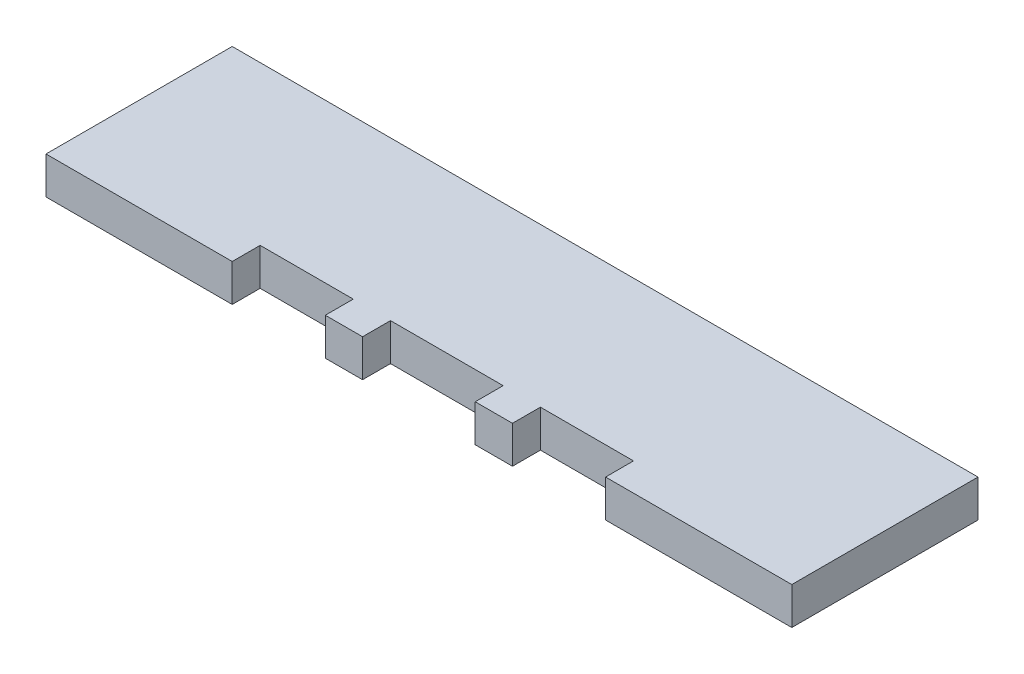
ISO-10303-21;
HEADER;
FILE_DESCRIPTION(('STEP AP214'),'2;1');
FILE_NAME('part.step','',(''),(''),'','','');
FILE_SCHEMA(('AUTOMOTIVE_DESIGN { 1 0 10303 214 1 1 1 1 }'));
ENDSEC;
DATA;
#1=APPLICATION_CONTEXT('core data for automotive mechanical design processes');
#2=APPLICATION_PROTOCOL_DEFINITION('international standard','automotive_design',2000,#1);
#3=PRODUCT_CONTEXT('',#1,'mechanical');
#4=PRODUCT('Part','Part','',(#3));
#5=PRODUCT_RELATED_PRODUCT_CATEGORY('part','',(#4));
#6=PRODUCT_DEFINITION_FORMATION('','',#4);
#7=PRODUCT_DEFINITION_CONTEXT('part definition',#1,'design');
#8=PRODUCT_DEFINITION('design','',#6,#7);
#9=PRODUCT_DEFINITION_SHAPE('','',#8);
#10=(LENGTH_UNIT() NAMED_UNIT(*) SI_UNIT(.MILLI.,.METRE.));
#11=(NAMED_UNIT(*) PLANE_ANGLE_UNIT() SI_UNIT($,.RADIAN.));
#12=(NAMED_UNIT(*) SI_UNIT($,.STERADIAN.) SOLID_ANGLE_UNIT());
#13=UNCERTAINTY_MEASURE_WITH_UNIT(LENGTH_MEASURE(1.E-05),#10,'distance_accuracy_value','');
#14=(GEOMETRIC_REPRESENTATION_CONTEXT(3) GLOBAL_UNCERTAINTY_ASSIGNED_CONTEXT((#13)) GLOBAL_UNIT_ASSIGNED_CONTEXT((#10,
#11,#12)) REPRESENTATION_CONTEXT('',''));
#15=CARTESIAN_POINT('',(0.,0.,0.));
#16=DIRECTION('',(0.,0.,1.));
#17=DIRECTION('',(1.,0.,0.));
#18=AXIS2_PLACEMENT_3D('',#15,#16,#17);
#19=CARTESIAN_POINT('',(0.,4.,-3.));
#20=DIRECTION('',(0.,0.,-1.));
#21=DIRECTION('',(-1.,0.,0.));
#22=AXIS2_PLACEMENT_3D('',#19,#20,#21);
#23=PLANE('',#22);
#24=DIRECTION('',(0.,-1.,0.));
#25=VECTOR('',#24,1.);
#26=CARTESIAN_POINT('',(10.,3.99999999999988,-3.));
#27=LINE('',#26,#25);
#28=CARTESIAN_POINT('',(10.,4.,-3.));
#29=VERTEX_POINT('',#28);
#30=CARTESIAN_POINT('',(10.,0.,-3.));
#31=VERTEX_POINT('',#30);
#32=EDGE_CURVE('E58',#29,#31,#27,.T.);
#33=ORIENTED_EDGE('',*,*,#32,.F.);
#34=DIRECTION('',(1.,0.,0.));
#35=VECTOR('',#34,1.);
#36=CARTESIAN_POINT('',(0.,4.,-3.));
#37=LINE('',#36,#35);
#38=CARTESIAN_POINT('',(0.,4.,-3.));
#39=VERTEX_POINT('',#38);
#40=EDGE_CURVE('E173',#39,#29,#37,.T.);
#41=ORIENTED_EDGE('',*,*,#40,.F.);
#42=DIRECTION('',(0.,-1.,0.));
#43=VECTOR('',#42,1.);
#44=CARTESIAN_POINT('',(0.,4.,-3.));
#45=LINE('',#44,#43);
#46=CARTESIAN_POINT('',(0.,0.,-3.));
#47=VERTEX_POINT('',#46);
#48=EDGE_CURVE('E43',#39,#47,#45,.T.);
#49=ORIENTED_EDGE('',*,*,#48,.T.);
#50=DIRECTION('',(1.,0.,0.));
#51=VECTOR('',#50,1.);
#52=CARTESIAN_POINT('',(0.,0.,-3.));
#53=LINE('',#52,#51);
#54=EDGE_CURVE('E230',#47,#31,#53,.T.);
#55=ORIENTED_EDGE('',*,*,#54,.T.);
#56=EDGE_LOOP('',(#33,#41,#49,#55));
#57=FACE_BOUND('',#56,.T.);
#58=ADVANCED_FACE('F35',(#57),#23,.F.);
#59=DIRECTION('',(0.,1.,0.));
#60=VECTOR('',#59,1.);
#61=CARTESIAN_POINT('',(14.,3.99999999999988,-3.));
#62=LINE('',#61,#60);
#63=CARTESIAN_POINT('',(14.,-1.15568032315708E-13,-3.));
#64=VERTEX_POINT('',#63);
#65=CARTESIAN_POINT('',(14.,4.,-3.));
#66=VERTEX_POINT('',#65);
#67=EDGE_CURVE('E169',#64,#66,#62,.T.);
#68=ORIENTED_EDGE('',*,*,#67,.F.);
#69=CARTESIAN_POINT('',(26.1,0.,-3.));
#70=VERTEX_POINT('',#69);
#71=EDGE_CURVE('E233',#64,#70,#53,.T.);
#72=ORIENTED_EDGE('',*,*,#71,.T.);
#73=DIRECTION('',(0.,-1.,0.));
#74=VECTOR('',#73,1.);
#75=CARTESIAN_POINT('',(26.1,4.,-3.));
#76=LINE('',#75,#74);
#77=CARTESIAN_POINT('',(26.1,4.,-3.));
#78=VERTEX_POINT('',#77);
#79=EDGE_CURVE('E174',#78,#70,#76,.T.);
#80=ORIENTED_EDGE('',*,*,#79,.F.);
#81=EDGE_CURVE('E50',#66,#78,#37,.T.);
#82=ORIENTED_EDGE('',*,*,#81,.F.);
#83=EDGE_LOOP('',(#68,#72,#80,#82));
#84=FACE_BOUND('',#83,.T.);
#85=ADVANCED_FACE('F278',(#84),#23,.F.);
#86=DIRECTION('',(0.,1.,0.));
#87=VECTOR('',#86,1.);
#88=CARTESIAN_POINT('',(30.1,4.,-3.));
#89=LINE('',#88,#87);
#90=CARTESIAN_POINT('',(30.1,0.,-3.));
#91=VERTEX_POINT('',#90);
#92=CARTESIAN_POINT('',(30.1,4.,-3.));
#93=VERTEX_POINT('',#92);
#94=EDGE_CURVE('E177',#91,#93,#89,.T.);
#95=ORIENTED_EDGE('',*,*,#94,.F.);
#96=CARTESIAN_POINT('',(40.1,0.,-3.));
#97=VERTEX_POINT('',#96);
#98=EDGE_CURVE('E229',#91,#97,#53,.T.);
#99=ORIENTED_EDGE('',*,*,#98,.T.);
#100=DIRECTION('',(0.,-1.,0.));
#101=VECTOR('',#100,1.);
#102=CARTESIAN_POINT('',(40.1,4.,-3.));
#103=LINE('',#102,#101);
#104=CARTESIAN_POINT('',(40.1,4.,-3.));
#105=VERTEX_POINT('',#104);
#106=EDGE_CURVE('E256',#105,#97,#103,.T.);
#107=ORIENTED_EDGE('',*,*,#106,.F.);
#108=EDGE_CURVE('E212',#93,#105,#37,.T.);
#109=ORIENTED_EDGE('',*,*,#108,.F.);
#110=EDGE_LOOP('',(#95,#99,#107,#109));
#111=FACE_BOUND('',#110,.T.);
#112=ADVANCED_FACE('F292',(#111),#23,.F.);
#113=CARTESIAN_POINT('',(-20.,4.,0.));
#114=DIRECTION('',(0.,0.,-1.));
#115=DIRECTION('',(-1.,0.,0.));
#116=AXIS2_PLACEMENT_3D('',#113,#114,#115);
#117=PLANE('',#116);
#118=DIRECTION('',(1.,0.,0.));
#119=VECTOR('',#118,1.);
#120=CARTESIAN_POINT('',(-20.,0.,0.));
#121=LINE('',#120,#119);
#122=CARTESIAN_POINT('',(-20.,0.,0.));
#123=VERTEX_POINT('',#122);
#124=CARTESIAN_POINT('',(0.,0.,0.));
#125=VERTEX_POINT('',#124);
#126=EDGE_CURVE('E206',#123,#125,#121,.T.);
#127=ORIENTED_EDGE('',*,*,#126,.T.);
#128=DIRECTION('',(0.,-1.,0.));
#129=VECTOR('',#128,1.);
#130=CARTESIAN_POINT('',(0.,4.,0.));
#131=LINE('',#130,#129);
#132=CARTESIAN_POINT('',(0.,4.,0.));
#133=VERTEX_POINT('',#132);
#134=EDGE_CURVE('E11',#133,#125,#131,.T.);
#135=ORIENTED_EDGE('',*,*,#134,.F.);
#136=DIRECTION('',(1.,0.,0.));
#137=VECTOR('',#136,1.);
#138=CARTESIAN_POINT('',(-20.,4.,0.));
#139=LINE('',#138,#137);
#140=CARTESIAN_POINT('',(-20.,4.,0.));
#141=VERTEX_POINT('',#140);
#142=EDGE_CURVE('E207',#141,#133,#139,.T.);
#143=ORIENTED_EDGE('',*,*,#142,.F.);
#144=DIRECTION('',(0.,-1.,0.));
#145=VECTOR('',#144,1.);
#146=CARTESIAN_POINT('',(-20.,4.,0.));
#147=LINE('',#146,#145);
#148=EDGE_CURVE('E224',#141,#123,#147,.T.);
#149=ORIENTED_EDGE('',*,*,#148,.T.);
#150=EDGE_LOOP('',(#127,#135,#143,#149));
#151=FACE_BOUND('',#150,.T.);
#152=ADVANCED_FACE('F37',(#151),#117,.F.);
#153=CARTESIAN_POINT('',(0.,4.,0.));
#154=DIRECTION('',(-1.,0.,0.));
#155=DIRECTION('',(0.,0.,1.));
#156=AXIS2_PLACEMENT_3D('',#153,#154,#155);
#157=PLANE('',#156);
#158=DIRECTION('',(0.,0.,-1.));
#159=VECTOR('',#158,1.);
#160=CARTESIAN_POINT('',(0.,0.,0.));
#161=LINE('',#160,#159);
#162=EDGE_CURVE('E227',#125,#47,#161,.T.);
#163=ORIENTED_EDGE('',*,*,#162,.T.);
#164=ORIENTED_EDGE('',*,*,#48,.F.);
#165=DIRECTION('',(0.,0.,-1.));
#166=VECTOR('',#165,1.);
#167=CARTESIAN_POINT('',(0.,4.,0.));
#168=LINE('',#167,#166);
#169=EDGE_CURVE('E209',#133,#39,#168,.T.);
#170=ORIENTED_EDGE('',*,*,#169,.F.);
#171=ORIENTED_EDGE('',*,*,#134,.T.);
#172=EDGE_LOOP('',(#163,#164,#170,#171));
#173=FACE_BOUND('',#172,.T.);
#174=ADVANCED_FACE('F321',(#173),#157,.F.);
#175=CARTESIAN_POINT('',(40.1,4.,-3.));
#176=DIRECTION('',(1.,0.,0.));
#177=DIRECTION('',(0.,0.,-1.));
#178=AXIS2_PLACEMENT_3D('',#175,#176,#177);
#179=PLANE('',#178);
#180=DIRECTION('',(0.,0.,1.));
#181=VECTOR('',#180,1.);
#182=CARTESIAN_POINT('',(40.1,0.,-3.));
#183=LINE('',#182,#181);
#184=CARTESIAN_POINT('',(40.1,0.,0.));
#185=VERTEX_POINT('',#184);
#186=EDGE_CURVE('E232',#97,#185,#183,.T.);
#187=ORIENTED_EDGE('',*,*,#186,.T.);
#188=DIRECTION('',(0.,-1.,0.));
#189=VECTOR('',#188,1.);
#190=CARTESIAN_POINT('',(40.1,4.,0.));
#191=LINE('',#190,#189);
#192=CARTESIAN_POINT('',(40.1,4.,0.));
#193=VERTEX_POINT('',#192);
#194=EDGE_CURVE('E253',#193,#185,#191,.T.);
#195=ORIENTED_EDGE('',*,*,#194,.F.);
#196=DIRECTION('',(0.,0.,1.));
#197=VECTOR('',#196,1.);
#198=CARTESIAN_POINT('',(40.1,4.,-3.));
#199=LINE('',#198,#197);
#200=EDGE_CURVE('E214',#105,#193,#199,.T.);
#201=ORIENTED_EDGE('',*,*,#200,.F.);
#202=ORIENTED_EDGE('',*,*,#106,.T.);
#203=EDGE_LOOP('',(#187,#195,#201,#202));
#204=FACE_BOUND('',#203,.T.);
#205=ADVANCED_FACE('F297',(#204),#179,.F.);
#206=CARTESIAN_POINT('',(40.1,4.,0.));
#207=DIRECTION('',(0.,0.,-1.));
#208=DIRECTION('',(-1.,0.,0.));
#209=AXIS2_PLACEMENT_3D('',#206,#207,#208);
#210=PLANE('',#209);
#211=DIRECTION('',(1.,0.,0.));
#212=VECTOR('',#211,1.);
#213=CARTESIAN_POINT('',(40.1,0.,0.));
#214=LINE('',#213,#212);
#215=CARTESIAN_POINT('',(60.1,0.,0.));
#216=VERTEX_POINT('',#215);
#217=EDGE_CURVE('E235',#185,#216,#214,.T.);
#218=ORIENTED_EDGE('',*,*,#217,.T.);
#219=DIRECTION('',(0.,-1.,0.));
#220=VECTOR('',#219,1.);
#221=CARTESIAN_POINT('',(60.1,4.,0.));
#222=LINE('',#221,#220);
#223=CARTESIAN_POINT('',(60.1,4.,0.));
#224=VERTEX_POINT('',#223);
#225=EDGE_CURVE('E250',#224,#216,#222,.T.);
#226=ORIENTED_EDGE('',*,*,#225,.F.);
#227=DIRECTION('',(1.,0.,0.));
#228=VECTOR('',#227,1.);
#229=CARTESIAN_POINT('',(40.1,4.,0.));
#230=LINE('',#229,#228);
#231=EDGE_CURVE('E216',#193,#224,#230,.T.);
#232=ORIENTED_EDGE('',*,*,#231,.F.);
#233=ORIENTED_EDGE('',*,*,#194,.T.);
#234=EDGE_LOOP('',(#218,#226,#232,#233));
#235=FACE_BOUND('',#234,.T.);
#236=ADVANCED_FACE('F303',(#235),#210,.F.);
#237=CARTESIAN_POINT('',(60.1,4.,0.));
#238=DIRECTION('',(-1.,0.,0.));
#239=DIRECTION('',(0.,0.,1.));
#240=AXIS2_PLACEMENT_3D('',#237,#238,#239);
#241=PLANE('',#240);
#242=DIRECTION('',(0.,0.,-1.));
#243=VECTOR('',#242,1.);
#244=CARTESIAN_POINT('',(60.1,0.,0.));
#245=LINE('',#244,#243);
#246=CARTESIAN_POINT('',(60.1,0.,-20.));
#247=VERTEX_POINT('',#246);
#248=EDGE_CURVE('E237',#216,#247,#245,.T.);
#249=ORIENTED_EDGE('',*,*,#248,.T.);
#250=DIRECTION('',(0.,-1.,0.));
#251=VECTOR('',#250,1.);
#252=CARTESIAN_POINT('',(60.1,4.,-20.));
#253=LINE('',#252,#251);
#254=CARTESIAN_POINT('',(60.1,4.,-20.));
#255=VERTEX_POINT('',#254);
#256=EDGE_CURVE('E247',#255,#247,#253,.T.);
#257=ORIENTED_EDGE('',*,*,#256,.F.);
#258=DIRECTION('',(0.,0.,-1.));
#259=VECTOR('',#258,1.);
#260=CARTESIAN_POINT('',(60.1,4.,0.));
#261=LINE('',#260,#259);
#262=EDGE_CURVE('E218',#224,#255,#261,.T.);
#263=ORIENTED_EDGE('',*,*,#262,.F.);
#264=ORIENTED_EDGE('',*,*,#225,.T.);
#265=EDGE_LOOP('',(#249,#257,#263,#264));
#266=FACE_BOUND('',#265,.T.);
#267=ADVANCED_FACE('F307',(#266),#241,.F.);
#268=CARTESIAN_POINT('',(60.1,4.,-20.));
#269=DIRECTION('',(0.,0.,1.));
#270=DIRECTION('',(1.,0.,0.));
#271=AXIS2_PLACEMENT_3D('',#268,#269,#270);
#272=PLANE('',#271);
#273=DIRECTION('',(-1.,0.,0.));
#274=VECTOR('',#273,1.);
#275=CARTESIAN_POINT('',(60.1,0.,-20.));
#276=LINE('',#275,#274);
#277=CARTESIAN_POINT('',(-20.,0.,-20.));
#278=VERTEX_POINT('',#277);
#279=EDGE_CURVE('E239',#247,#278,#276,.T.);
#280=ORIENTED_EDGE('',*,*,#279,.T.);
#281=DIRECTION('',(0.,-1.,0.));
#282=VECTOR('',#281,1.);
#283=CARTESIAN_POINT('',(-20.,4.,-20.));
#284=LINE('',#283,#282);
#285=CARTESIAN_POINT('',(-20.,4.,-20.));
#286=VERTEX_POINT('',#285);
#287=EDGE_CURVE('E244',#286,#278,#284,.T.);
#288=ORIENTED_EDGE('',*,*,#287,.F.);
#289=DIRECTION('',(-1.,0.,0.));
#290=VECTOR('',#289,1.);
#291=CARTESIAN_POINT('',(60.1,4.,-20.));
#292=LINE('',#291,#290);
#293=EDGE_CURVE('E220',#255,#286,#292,.T.);
#294=ORIENTED_EDGE('',*,*,#293,.F.);
#295=ORIENTED_EDGE('',*,*,#256,.T.);
#296=EDGE_LOOP('',(#280,#288,#294,#295));
#297=FACE_BOUND('',#296,.T.);
#298=ADVANCED_FACE('F312',(#297),#272,.F.);
#299=CARTESIAN_POINT('',(-20.,4.,-20.));
#300=DIRECTION('',(1.,0.,0.));
#301=DIRECTION('',(0.,0.,-1.));
#302=AXIS2_PLACEMENT_3D('',#299,#300,#301);
#303=PLANE('',#302);
#304=DIRECTION('',(0.,0.,1.));
#305=VECTOR('',#304,1.);
#306=CARTESIAN_POINT('',(-20.,0.,-20.));
#307=LINE('',#306,#305);
#308=EDGE_CURVE('E210',#278,#123,#307,.T.);
#309=ORIENTED_EDGE('',*,*,#308,.T.);
#310=ORIENTED_EDGE('',*,*,#148,.F.);
#311=DIRECTION('',(0.,0.,1.));
#312=VECTOR('',#311,1.);
#313=CARTESIAN_POINT('',(-20.,4.,-20.));
#314=LINE('',#313,#312);
#315=EDGE_CURVE('E222',#286,#141,#314,.T.);
#316=ORIENTED_EDGE('',*,*,#315,.F.);
#317=ORIENTED_EDGE('',*,*,#287,.T.);
#318=EDGE_LOOP('',(#309,#310,#316,#317));
#319=FACE_BOUND('',#318,.T.);
#320=ADVANCED_FACE('F318',(#319),#303,.F.);
#321=CARTESIAN_POINT('',(0.,4.,0.));
#322=DIRECTION('',(0.,1.,0.));
#323=DIRECTION('',(0.,0.,1.));
#324=AXIS2_PLACEMENT_3D('',#321,#322,#323);
#325=PLANE('',#324);
#326=ORIENTED_EDGE('',*,*,#142,.T.);
#327=ORIENTED_EDGE('',*,*,#169,.T.);
#328=ORIENTED_EDGE('',*,*,#40,.T.);
#329=DIRECTION('',(0.,0.,-1.));
#330=VECTOR('',#329,1.);
#331=CARTESIAN_POINT('',(10.,3.99999999999988,0.));
#332=LINE('',#331,#330);
#333=CARTESIAN_POINT('',(10.,3.99999999999988,0.));
#334=VERTEX_POINT('',#333);
#335=EDGE_CURVE('E154',#334,#29,#332,.T.);
#336=ORIENTED_EDGE('',*,*,#335,.F.);
#337=DIRECTION('',(-1.,0.,0.));
#338=VECTOR('',#337,1.);
#339=CARTESIAN_POINT('',(10.,3.99999999999988,0.));
#340=LINE('',#339,#338);
#341=CARTESIAN_POINT('',(14.,3.99999999999988,0.));
#342=VERTEX_POINT('',#341);
#343=EDGE_CURVE('E160',#342,#334,#340,.T.);
#344=ORIENTED_EDGE('',*,*,#343,.F.);
#345=DIRECTION('',(0.,0.,-1.));
#346=VECTOR('',#345,1.);
#347=CARTESIAN_POINT('',(14.,3.99999999999988,0.));
#348=LINE('',#347,#346);
#349=EDGE_CURVE('E268',#342,#66,#348,.T.);
#350=ORIENTED_EDGE('',*,*,#349,.T.);
#351=ORIENTED_EDGE('',*,*,#81,.T.);
#352=DIRECTION('',(0.,0.,-1.));
#353=VECTOR('',#352,1.);
#354=CARTESIAN_POINT('',(26.1,4.,0.));
#355=LINE('',#354,#353);
#356=CARTESIAN_POINT('',(26.1,4.,0.));
#357=VERTEX_POINT('',#356);
#358=EDGE_CURVE('E191',#357,#78,#355,.T.);
#359=ORIENTED_EDGE('',*,*,#358,.F.);
#360=DIRECTION('',(-1.,0.,0.));
#361=VECTOR('',#360,1.);
#362=CARTESIAN_POINT('',(26.1,4.,0.));
#363=LINE('',#362,#361);
#364=CARTESIAN_POINT('',(30.1,4.,0.));
#365=VERTEX_POINT('',#364);
#366=EDGE_CURVE('E190',#365,#357,#363,.T.);
#367=ORIENTED_EDGE('',*,*,#366,.F.);
#368=DIRECTION('',(0.,0.,-1.));
#369=VECTOR('',#368,1.);
#370=CARTESIAN_POINT('',(30.1,4.,0.));
#371=LINE('',#370,#369);
#372=EDGE_CURVE('E197',#365,#93,#371,.T.);
#373=ORIENTED_EDGE('',*,*,#372,.T.);
#374=ORIENTED_EDGE('',*,*,#108,.T.);
#375=ORIENTED_EDGE('',*,*,#200,.T.);
#376=ORIENTED_EDGE('',*,*,#231,.T.);
#377=ORIENTED_EDGE('',*,*,#262,.T.);
#378=ORIENTED_EDGE('',*,*,#293,.T.);
#379=ORIENTED_EDGE('',*,*,#315,.T.);
#380=EDGE_LOOP('',(#326,#327,#328,#336,#344,#350,#351,#359,#367,#373,#374,#375,#376,#377,#378,#379));
#381=FACE_BOUND('',#380,.T.);
#382=ADVANCED_FACE('F172',(#381),#325,.T.);
#383=CARTESIAN_POINT('',(0.,0.,0.));
#384=DIRECTION('',(0.,1.,0.));
#385=DIRECTION('',(0.,0.,1.));
#386=AXIS2_PLACEMENT_3D('',#383,#384,#385);
#387=PLANE('',#386);
#388=ORIENTED_EDGE('',*,*,#126,.F.);
#389=ORIENTED_EDGE('',*,*,#308,.F.);
#390=ORIENTED_EDGE('',*,*,#279,.F.);
#391=ORIENTED_EDGE('',*,*,#248,.F.);
#392=ORIENTED_EDGE('',*,*,#217,.F.);
#393=ORIENTED_EDGE('',*,*,#186,.F.);
#394=ORIENTED_EDGE('',*,*,#98,.F.);
#395=DIRECTION('',(0.,0.,-1.));
#396=VECTOR('',#395,1.);
#397=CARTESIAN_POINT('',(30.1,0.,0.));
#398=LINE('',#397,#396);
#399=CARTESIAN_POINT('',(30.1,0.,0.));
#400=VERTEX_POINT('',#399);
#401=EDGE_CURVE('E200',#400,#91,#398,.T.);
#402=ORIENTED_EDGE('',*,*,#401,.F.);
#403=DIRECTION('',(1.,0.,0.));
#404=VECTOR('',#403,1.);
#405=CARTESIAN_POINT('',(26.1,0.,0.));
#406=LINE('',#405,#404);
#407=CARTESIAN_POINT('',(26.1,0.,0.));
#408=VERTEX_POINT('',#407);
#409=EDGE_CURVE('E186',#408,#400,#406,.T.);
#410=ORIENTED_EDGE('',*,*,#409,.F.);
#411=DIRECTION('',(0.,0.,-1.));
#412=VECTOR('',#411,1.);
#413=CARTESIAN_POINT('',(26.1,0.,0.));
#414=LINE('',#413,#412);
#415=EDGE_CURVE('E203',#408,#70,#414,.T.);
#416=ORIENTED_EDGE('',*,*,#415,.T.);
#417=ORIENTED_EDGE('',*,*,#71,.F.);
#418=DIRECTION('',(0.,0.,-1.));
#419=VECTOR('',#418,1.);
#420=CARTESIAN_POINT('',(14.,-1.15568032315708E-13,0.));
#421=LINE('',#420,#419);
#422=CARTESIAN_POINT('',(14.,-1.15568032315708E-13,0.));
#423=VERTEX_POINT('',#422);
#424=EDGE_CURVE('E179',#423,#64,#421,.T.);
#425=ORIENTED_EDGE('',*,*,#424,.F.);
#426=DIRECTION('',(1.,0.,0.));
#427=VECTOR('',#426,1.);
#428=CARTESIAN_POINT('',(10.,-1.15568032315708E-13,0.));
#429=LINE('',#428,#427);
#430=CARTESIAN_POINT('',(10.,-1.15568032315708E-13,0.));
#431=VERTEX_POINT('',#430);
#432=EDGE_CURVE('E159',#431,#423,#429,.T.);
#433=ORIENTED_EDGE('',*,*,#432,.F.);
#434=DIRECTION('',(0.,0.,-1.));
#435=VECTOR('',#434,1.);
#436=CARTESIAN_POINT('',(10.,-1.15568032315708E-13,0.));
#437=LINE('',#436,#435);
#438=EDGE_CURVE('E156',#431,#31,#437,.T.);
#439=ORIENTED_EDGE('',*,*,#438,.T.);
#440=ORIENTED_EDGE('',*,*,#54,.F.);
#441=ORIENTED_EDGE('',*,*,#162,.F.);
#442=EDGE_LOOP('',(#388,#389,#390,#391,#392,#393,#394,#402,#410,#416,#417,#425,#433,#439,#440,#441));
#443=FACE_BOUND('',#442,.T.);
#444=ADVANCED_FACE('F264',(#443),#387,.F.);
#445=CARTESIAN_POINT('',(26.1,4.,0.));
#446=DIRECTION('',(1.,0.,0.));
#447=DIRECTION('',(0.,0.,-1.));
#448=AXIS2_PLACEMENT_3D('',#445,#446,#447);
#449=PLANE('',#448);
#450=ORIENTED_EDGE('',*,*,#79,.T.);
#451=ORIENTED_EDGE('',*,*,#415,.F.);
#452=DIRECTION('',(0.,-1.,0.));
#453=VECTOR('',#452,1.);
#454=CARTESIAN_POINT('',(26.1,4.,0.));
#455=LINE('',#454,#453);
#456=EDGE_CURVE('E183',#357,#408,#455,.T.);
#457=ORIENTED_EDGE('',*,*,#456,.F.);
#458=ORIENTED_EDGE('',*,*,#358,.T.);
#459=EDGE_LOOP('',(#450,#451,#457,#458));
#460=FACE_BOUND('',#459,.T.);
#461=ADVANCED_FACE('F281',(#460),#449,.F.);
#462=CARTESIAN_POINT('',(30.1,4.,0.));
#463=DIRECTION('',(-1.,0.,0.));
#464=DIRECTION('',(0.,0.,1.));
#465=AXIS2_PLACEMENT_3D('',#462,#463,#464);
#466=PLANE('',#465);
#467=ORIENTED_EDGE('',*,*,#94,.T.);
#468=ORIENTED_EDGE('',*,*,#372,.F.);
#469=DIRECTION('',(0.,1.,0.));
#470=VECTOR('',#469,1.);
#471=CARTESIAN_POINT('',(30.1,4.,0.));
#472=LINE('',#471,#470);
#473=EDGE_CURVE('E188',#400,#365,#472,.T.);
#474=ORIENTED_EDGE('',*,*,#473,.F.);
#475=ORIENTED_EDGE('',*,*,#401,.T.);
#476=EDGE_LOOP('',(#467,#468,#474,#475));
#477=FACE_BOUND('',#476,.T.);
#478=ADVANCED_FACE('F289',(#477),#466,.F.);
#479=CARTESIAN_POINT('',(0.,0.,0.));
#480=DIRECTION('',(0.,0.,1.));
#481=DIRECTION('',(1.,0.,0.));
#482=AXIS2_PLACEMENT_3D('',#479,#480,#481);
#483=PLANE('',#482);
#484=ORIENTED_EDGE('',*,*,#456,.T.);
#485=ORIENTED_EDGE('',*,*,#409,.T.);
#486=ORIENTED_EDGE('',*,*,#473,.T.);
#487=ORIENTED_EDGE('',*,*,#366,.T.);
#488=EDGE_LOOP('',(#484,#485,#486,#487));
#489=FACE_BOUND('',#488,.T.);
#490=ADVANCED_FACE('F283',(#489),#483,.T.);
#491=CARTESIAN_POINT('',(10.,3.99999999999988,0.));
#492=DIRECTION('',(1.,0.,0.));
#493=DIRECTION('',(0.,0.,-1.));
#494=AXIS2_PLACEMENT_3D('',#491,#492,#493);
#495=PLANE('',#494);
#496=ORIENTED_EDGE('',*,*,#32,.T.);
#497=ORIENTED_EDGE('',*,*,#438,.F.);
#498=DIRECTION('',(0.,-1.,0.));
#499=VECTOR('',#498,1.);
#500=CARTESIAN_POINT('',(10.,3.99999999999988,0.));
#501=LINE('',#500,#499);
#502=EDGE_CURVE('E150',#334,#431,#501,.T.);
#503=ORIENTED_EDGE('',*,*,#502,.F.);
#504=ORIENTED_EDGE('',*,*,#335,.T.);
#505=EDGE_LOOP('',(#496,#497,#503,#504));
#506=FACE_BOUND('',#505,.T.);
#507=ADVANCED_FACE('F152',(#506),#495,.F.);
#508=CARTESIAN_POINT('',(14.,3.99999999999988,0.));
#509=DIRECTION('',(-1.,0.,0.));
#510=DIRECTION('',(0.,0.,1.));
#511=AXIS2_PLACEMENT_3D('',#508,#509,#510);
#512=PLANE('',#511);
#513=ORIENTED_EDGE('',*,*,#67,.T.);
#514=ORIENTED_EDGE('',*,*,#349,.F.);
#515=DIRECTION('',(0.,1.,0.));
#516=VECTOR('',#515,1.);
#517=CARTESIAN_POINT('',(14.,3.99999999999988,0.));
#518=LINE('',#517,#516);
#519=EDGE_CURVE('E165',#423,#342,#518,.T.);
#520=ORIENTED_EDGE('',*,*,#519,.F.);
#521=ORIENTED_EDGE('',*,*,#424,.T.);
#522=EDGE_LOOP('',(#513,#514,#520,#521));
#523=FACE_BOUND('',#522,.T.);
#524=ADVANCED_FACE('F274',(#523),#512,.F.);
#525=CARTESIAN_POINT('',(0.,0.,0.));
#526=DIRECTION('',(0.,0.,-1.));
#527=DIRECTION('',(-1.,0.,0.));
#528=AXIS2_PLACEMENT_3D('',#525,#526,#527);
#529=PLANE('',#528);
#530=ORIENTED_EDGE('',*,*,#343,.T.);
#531=ORIENTED_EDGE('',*,*,#502,.T.);
#532=ORIENTED_EDGE('',*,*,#432,.T.);
#533=ORIENTED_EDGE('',*,*,#519,.T.);
#534=EDGE_LOOP('',(#530,#531,#532,#533));
#535=FACE_BOUND('',#534,.T.);
#536=ADVANCED_FACE('F163',(#535),#529,.F.);
#537=CLOSED_SHELL('',(#58,#85,#112,#152,#174,#205,#236,#267,#298,#320,#382,#444,#461,#478,#490,
#507,#524,#536));
#538=MANIFOLD_SOLID_BREP('B2',#537);
#539=ADVANCED_BREP_SHAPE_REPRESENTATION('',(#18,#538),#14);
#540=SHAPE_DEFINITION_REPRESENTATION(#9,#539);
ENDSEC;
END-ISO-10303-21;
